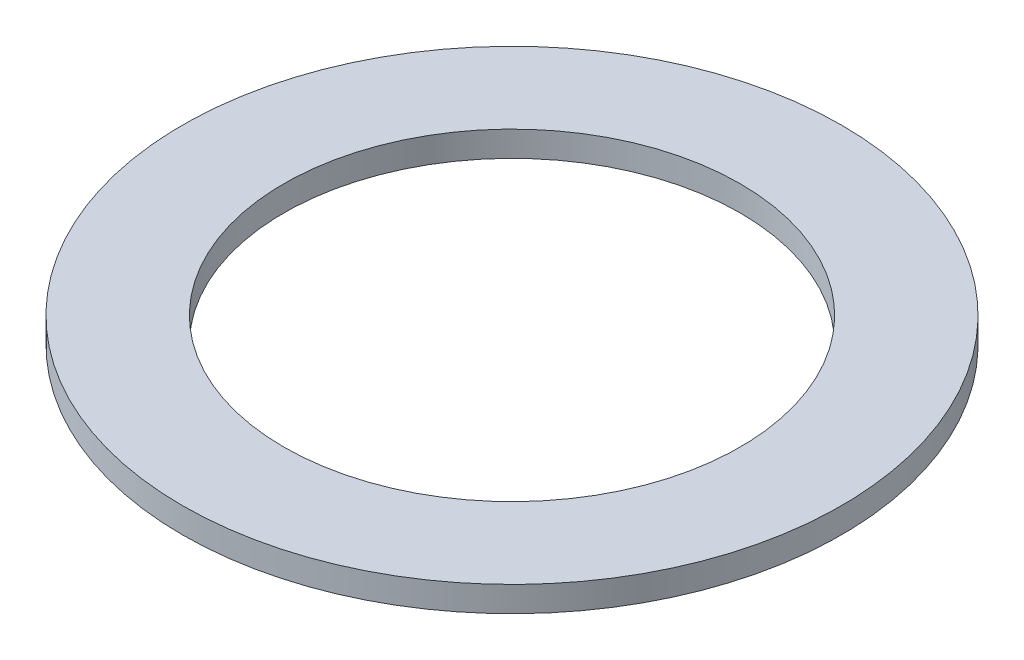
ISO-10303-21;
HEADER;
FILE_DESCRIPTION(('STEP AP214'),'2;1');
FILE_NAME('part.step','',(''),(''),'','','');
FILE_SCHEMA(('AUTOMOTIVE_DESIGN { 1 0 10303 214 1 1 1 1 }'));
ENDSEC;
DATA;
#1=APPLICATION_CONTEXT('core data for automotive mechanical design processes');
#2=APPLICATION_PROTOCOL_DEFINITION('international standard','automotive_design',2000,#1);
#3=PRODUCT_CONTEXT('',#1,'mechanical');
#4=PRODUCT('Part','Part','',(#3));
#5=PRODUCT_RELATED_PRODUCT_CATEGORY('part','',(#4));
#6=PRODUCT_DEFINITION_FORMATION('','',#4);
#7=PRODUCT_DEFINITION_CONTEXT('part definition',#1,'design');
#8=PRODUCT_DEFINITION('design','',#6,#7);
#9=PRODUCT_DEFINITION_SHAPE('','',#8);
#10=(LENGTH_UNIT() NAMED_UNIT(*) SI_UNIT(.MILLI.,.METRE.));
#11=(NAMED_UNIT(*) PLANE_ANGLE_UNIT() SI_UNIT($,.RADIAN.));
#12=(NAMED_UNIT(*) SI_UNIT($,.STERADIAN.) SOLID_ANGLE_UNIT());
#13=UNCERTAINTY_MEASURE_WITH_UNIT(LENGTH_MEASURE(1.E-05),#10,'distance_accuracy_value','');
#14=(GEOMETRIC_REPRESENTATION_CONTEXT(3) GLOBAL_UNCERTAINTY_ASSIGNED_CONTEXT((#13)) GLOBAL_UNIT_ASSIGNED_CONTEXT((#10,
#11,#12)) REPRESENTATION_CONTEXT('',''));
#15=CARTESIAN_POINT('',(0.,0.,0.));
#16=DIRECTION('',(0.,0.,1.));
#17=DIRECTION('',(1.,0.,0.));
#18=AXIS2_PLACEMENT_3D('',#15,#16,#17);
#19=CARTESIAN_POINT('',(0.,0.,0.));
#20=DIRECTION('',(0.,1.,0.));
#21=DIRECTION('',(0.,0.,1.));
#22=AXIS2_PLACEMENT_3D('',#19,#20,#21);
#23=PLANE('',#22);
#24=CARTESIAN_POINT('',(0.,0.,0.));
#25=DIRECTION('',(0.,-1.,0.));
#26=DIRECTION('',(0.,0.,-1.));
#27=AXIS2_PLACEMENT_3D('',#24,#25,#26);
#28=CIRCLE('',#27,4.5);
#29=CARTESIAN_POINT('',(0.,0.,-4.5));
#30=VERTEX_POINT('',#29);
#31=EDGE_CURVE('E28',#30,#30,#28,.F.);
#32=ORIENTED_EDGE('',*,*,#31,.T.);
#33=EDGE_LOOP('',(#32));
#34=FACE_BOUND('',#33,.T.);
#35=CARTESIAN_POINT('',(0.,0.,0.));
#36=DIRECTION('',(0.,-1.,0.));
#37=DIRECTION('',(0.,0.,-1.));
#38=AXIS2_PLACEMENT_3D('',#35,#36,#37);
#39=CIRCLE('',#38,6.5);
#40=CARTESIAN_POINT('',(0.,0.,-6.5));
#41=VERTEX_POINT('',#40);
#42=EDGE_CURVE('E19',#41,#41,#39,.F.);
#43=ORIENTED_EDGE('',*,*,#42,.F.);
#44=EDGE_LOOP('',(#43));
#45=FACE_BOUND('',#44,.T.);
#46=ADVANCED_FACE('F15',(#34,#45),#23,.F.);
#47=CARTESIAN_POINT('',(0.,0.5,0.));
#48=DIRECTION('',(0.,-1.,0.));
#49=DIRECTION('',(0.,0.,-1.));
#50=AXIS2_PLACEMENT_3D('',#47,#48,#49);
#51=CYLINDRICAL_SURFACE('',#50,6.5);
#52=ORIENTED_EDGE('',*,*,#42,.T.);
#53=EDGE_LOOP('',(#52));
#54=FACE_BOUND('',#53,.T.);
#55=CARTESIAN_POINT('',(0.,0.5,0.));
#56=DIRECTION('',(0.,-1.,0.));
#57=DIRECTION('',(0.,0.,-1.));
#58=AXIS2_PLACEMENT_3D('',#55,#56,#57);
#59=CIRCLE('',#58,6.5);
#60=CARTESIAN_POINT('',(0.,0.5,-6.5));
#61=VERTEX_POINT('',#60);
#62=EDGE_CURVE('E23',#61,#61,#59,.F.);
#63=ORIENTED_EDGE('',*,*,#62,.F.);
#64=EDGE_LOOP('',(#63));
#65=FACE_BOUND('',#64,.T.);
#66=ADVANCED_FACE('F36',(#54,#65),#51,.T.);
#67=CARTESIAN_POINT('',(0.,0.5,0.));
#68=DIRECTION('',(0.,-1.,0.));
#69=DIRECTION('',(0.,0.,-1.));
#70=AXIS2_PLACEMENT_3D('',#67,#68,#69);
#71=CYLINDRICAL_SURFACE('',#70,4.5);
#72=CARTESIAN_POINT('',(0.,0.5,0.));
#73=DIRECTION('',(0.,-1.,0.));
#74=DIRECTION('',(0.,0.,-1.));
#75=AXIS2_PLACEMENT_3D('',#72,#73,#74);
#76=CIRCLE('',#75,4.5);
#77=CARTESIAN_POINT('',(0.,0.5,-4.5));
#78=VERTEX_POINT('',#77);
#79=EDGE_CURVE('E10',#78,#78,#76,.T.);
#80=ORIENTED_EDGE('',*,*,#79,.F.);
#81=EDGE_LOOP('',(#80));
#82=FACE_BOUND('',#81,.T.);
#83=ORIENTED_EDGE('',*,*,#31,.F.);
#84=EDGE_LOOP('',(#83));
#85=FACE_BOUND('',#84,.T.);
#86=ADVANCED_FACE('F45',(#82,#85),#71,.F.);
#87=CARTESIAN_POINT('',(0.,0.5,0.));
#88=DIRECTION('',(0.,1.,0.));
#89=DIRECTION('',(0.,0.,1.));
#90=AXIS2_PLACEMENT_3D('',#87,#88,#89);
#91=PLANE('',#90);
#92=ORIENTED_EDGE('',*,*,#79,.T.);
#93=EDGE_LOOP('',(#92));
#94=FACE_BOUND('',#93,.T.);
#95=ORIENTED_EDGE('',*,*,#62,.T.);
#96=EDGE_LOOP('',(#95));
#97=FACE_BOUND('',#96,.T.);
#98=ADVANCED_FACE('F17',(#94,#97),#91,.T.);
#99=CLOSED_SHELL('',(#46,#66,#86,#98));
#100=MANIFOLD_SOLID_BREP('B1',#99);
#101=ADVANCED_BREP_SHAPE_REPRESENTATION('',(#18,#100),#14);
#102=SHAPE_DEFINITION_REPRESENTATION(#9,#101);
ENDSEC;
END-ISO-10303-21;
